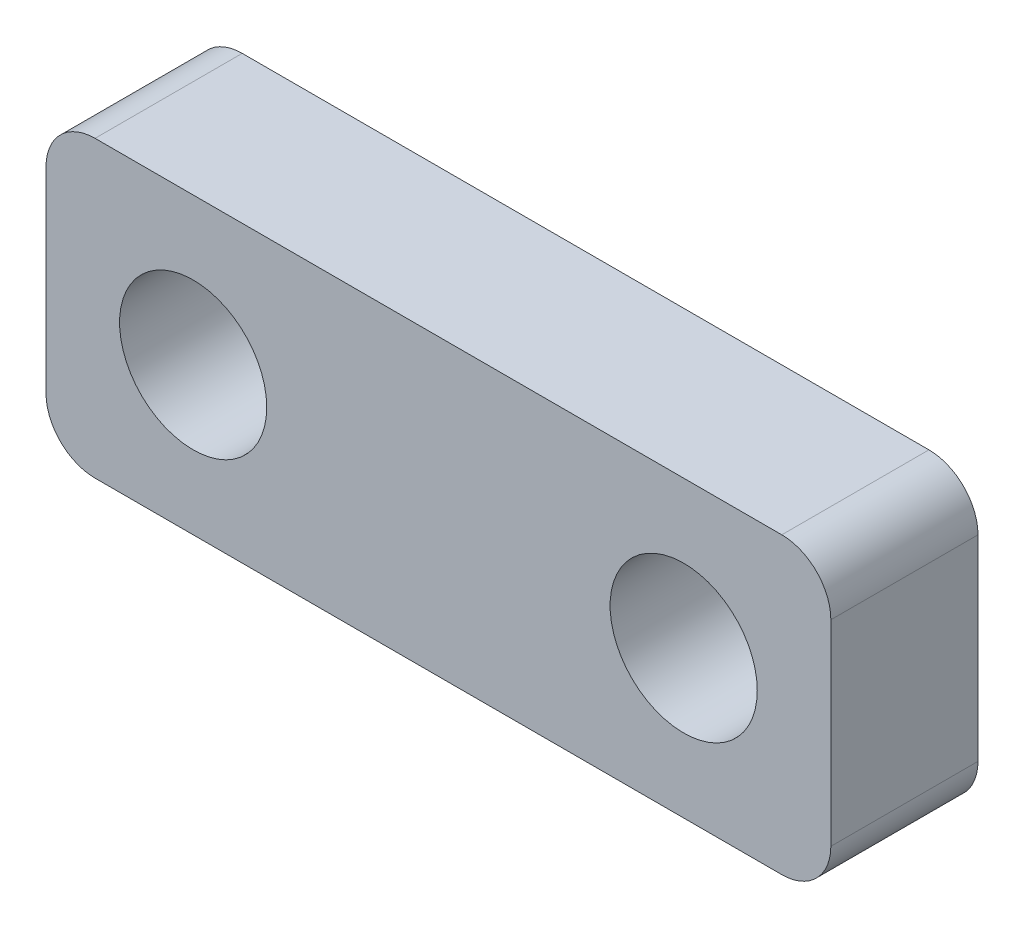
ISO-10303-21;
HEADER;
FILE_DESCRIPTION(('STEP AP214'),'2;1');
FILE_NAME('part.step','',(''),(''),'','','');
FILE_SCHEMA(('AUTOMOTIVE_DESIGN { 1 0 10303 214 1 1 1 1 }'));
ENDSEC;
DATA;
#1=APPLICATION_CONTEXT('core data for automotive mechanical design processes');
#2=APPLICATION_PROTOCOL_DEFINITION('international standard','automotive_design',2000,#1);
#3=PRODUCT_CONTEXT('',#1,'mechanical');
#4=PRODUCT('Part','Part','',(#3));
#5=PRODUCT_RELATED_PRODUCT_CATEGORY('part','',(#4));
#6=PRODUCT_DEFINITION_FORMATION('','',#4);
#7=PRODUCT_DEFINITION_CONTEXT('part definition',#1,'design');
#8=PRODUCT_DEFINITION('design','',#6,#7);
#9=PRODUCT_DEFINITION_SHAPE('','',#8);
#10=(LENGTH_UNIT() NAMED_UNIT(*) SI_UNIT(.MILLI.,.METRE.));
#11=(NAMED_UNIT(*) PLANE_ANGLE_UNIT() SI_UNIT($,.RADIAN.));
#12=(NAMED_UNIT(*) SI_UNIT($,.STERADIAN.) SOLID_ANGLE_UNIT());
#13=UNCERTAINTY_MEASURE_WITH_UNIT(LENGTH_MEASURE(1.E-05),#10,'distance_accuracy_value','');
#14=(GEOMETRIC_REPRESENTATION_CONTEXT(3) GLOBAL_UNCERTAINTY_ASSIGNED_CONTEXT((#13)) GLOBAL_UNIT_ASSIGNED_CONTEXT((#10,
#11,#12)) REPRESENTATION_CONTEXT('',''));
#15=CARTESIAN_POINT('',(0.,0.,0.));
#16=DIRECTION('',(0.,0.,1.));
#17=DIRECTION('',(1.,0.,0.));
#18=AXIS2_PLACEMENT_3D('',#15,#16,#17);
#19=CARTESIAN_POINT('',(8.,3.,3.));
#20=DIRECTION('',(-1.,0.,0.));
#21=DIRECTION('',(0.,0.,1.));
#22=AXIS2_PLACEMENT_3D('',#19,#20,#21);
#23=PLANE('',#22);
#24=DIRECTION('',(0.,1.,0.));
#25=VECTOR('',#24,1.);
#26=CARTESIAN_POINT('',(8.,3.,0.));
#27=LINE('',#26,#25);
#28=CARTESIAN_POINT('',(8.,-2.,0.));
#29=VERTEX_POINT('',#28);
#30=CARTESIAN_POINT('',(8.,2.,0.));
#31=VERTEX_POINT('',#30);
#32=EDGE_CURVE('E146',#29,#31,#27,.T.);
#33=ORIENTED_EDGE('',*,*,#32,.T.);
#34=DIRECTION('',(0.,0.,-1.));
#35=VECTOR('',#34,1.);
#36=CARTESIAN_POINT('',(8.,2.,3.));
#37=LINE('',#36,#35);
#38=CARTESIAN_POINT('',(8.,2.,3.));
#39=VERTEX_POINT('',#38);
#40=EDGE_CURVE('E180',#31,#39,#37,.F.);
#41=ORIENTED_EDGE('',*,*,#40,.T.);
#42=DIRECTION('',(0.,1.,0.));
#43=VECTOR('',#42,1.);
#44=CARTESIAN_POINT('',(8.,3.,3.));
#45=LINE('',#44,#43);
#46=CARTESIAN_POINT('',(8.,-2.,3.));
#47=VERTEX_POINT('',#46);
#48=EDGE_CURVE('E144',#47,#39,#45,.T.);
#49=ORIENTED_EDGE('',*,*,#48,.F.);
#50=DIRECTION('',(0.,0.,-1.));
#51=VECTOR('',#50,1.);
#52=CARTESIAN_POINT('',(8.,-2.,3.));
#53=LINE('',#52,#51);
#54=EDGE_CURVE('E176',#47,#29,#53,.T.);
#55=ORIENTED_EDGE('',*,*,#54,.T.);
#56=EDGE_LOOP('',(#33,#41,#49,#55));
#57=FACE_BOUND('',#56,.T.);
#58=ADVANCED_FACE('F45',(#57),#23,.F.);
#59=CARTESIAN_POINT('',(-8.,3.,3.));
#60=DIRECTION('',(0.,-1.,0.));
#61=DIRECTION('',(0.,0.,-1.));
#62=AXIS2_PLACEMENT_3D('',#59,#60,#61);
#63=PLANE('',#62);
#64=DIRECTION('',(-1.,0.,0.));
#65=VECTOR('',#64,1.);
#66=CARTESIAN_POINT('',(-8.,3.,0.));
#67=LINE('',#66,#65);
#68=CARTESIAN_POINT('',(7.,3.,0.));
#69=VERTEX_POINT('',#68);
#70=CARTESIAN_POINT('',(-7.,3.,0.));
#71=VERTEX_POINT('',#70);
#72=EDGE_CURVE('E140',#69,#71,#67,.T.);
#73=ORIENTED_EDGE('',*,*,#72,.T.);
#74=DIRECTION('',(0.,0.,-1.));
#75=VECTOR('',#74,1.);
#76=CARTESIAN_POINT('',(-7.,3.,3.));
#77=LINE('',#76,#75);
#78=CARTESIAN_POINT('',(-7.,3.,3.));
#79=VERTEX_POINT('',#78);
#80=EDGE_CURVE('E116',#71,#79,#77,.F.);
#81=ORIENTED_EDGE('',*,*,#80,.T.);
#82=DIRECTION('',(-1.,0.,0.));
#83=VECTOR('',#82,1.);
#84=CARTESIAN_POINT('',(-8.,3.,3.));
#85=LINE('',#84,#83);
#86=CARTESIAN_POINT('',(7.,3.,3.));
#87=VERTEX_POINT('',#86);
#88=EDGE_CURVE('E199',#87,#79,#85,.T.);
#89=ORIENTED_EDGE('',*,*,#88,.F.);
#90=DIRECTION('',(0.,0.,-1.));
#91=VECTOR('',#90,1.);
#92=CARTESIAN_POINT('',(7.,3.,3.));
#93=LINE('',#92,#91);
#94=EDGE_CURVE('E122',#87,#69,#93,.T.);
#95=ORIENTED_EDGE('',*,*,#94,.T.);
#96=EDGE_LOOP('',(#73,#81,#89,#95));
#97=FACE_BOUND('',#96,.T.);
#98=ADVANCED_FACE('F246',(#97),#63,.F.);
#99=CARTESIAN_POINT('',(-8.,3.,3.));
#100=DIRECTION('',(1.,0.,0.));
#101=DIRECTION('',(0.,0.,-1.));
#102=AXIS2_PLACEMENT_3D('',#99,#100,#101);
#103=PLANE('',#102);
#104=DIRECTION('',(0.,-1.,0.));
#105=VECTOR('',#104,1.);
#106=CARTESIAN_POINT('',(-8.,3.,3.));
#107=LINE('',#106,#105);
#108=CARTESIAN_POINT('',(-8.,2.,3.));
#109=VERTEX_POINT('',#108);
#110=CARTESIAN_POINT('',(-8.,-2.,3.));
#111=VERTEX_POINT('',#110);
#112=EDGE_CURVE('E131',#109,#111,#107,.T.);
#113=ORIENTED_EDGE('',*,*,#112,.F.);
#114=DIRECTION('',(0.,0.,-1.));
#115=VECTOR('',#114,1.);
#116=CARTESIAN_POINT('',(-8.,2.,3.));
#117=LINE('',#116,#115);
#118=CARTESIAN_POINT('',(-8.,2.,0.));
#119=VERTEX_POINT('',#118);
#120=EDGE_CURVE('E115',#109,#119,#117,.T.);
#121=ORIENTED_EDGE('',*,*,#120,.T.);
#122=DIRECTION('',(0.,-1.,0.));
#123=VECTOR('',#122,1.);
#124=CARTESIAN_POINT('',(-8.,3.,0.));
#125=LINE('',#124,#123);
#126=CARTESIAN_POINT('',(-8.,-2.,0.));
#127=VERTEX_POINT('',#126);
#128=EDGE_CURVE('E129',#119,#127,#125,.T.);
#129=ORIENTED_EDGE('',*,*,#128,.T.);
#130=DIRECTION('',(0.,0.,-1.));
#131=VECTOR('',#130,1.);
#132=CARTESIAN_POINT('',(-8.,-2.,3.));
#133=LINE('',#132,#131);
#134=EDGE_CURVE('E134',#127,#111,#133,.F.);
#135=ORIENTED_EDGE('',*,*,#134,.T.);
#136=EDGE_LOOP('',(#113,#121,#129,#135));
#137=FACE_BOUND('',#136,.T.);
#138=ADVANCED_FACE('F128',(#137),#103,.F.);
#139=CARTESIAN_POINT('',(-8.,-3.,3.));
#140=DIRECTION('',(0.,1.,0.));
#141=DIRECTION('',(0.,0.,1.));
#142=AXIS2_PLACEMENT_3D('',#139,#140,#141);
#143=PLANE('',#142);
#144=DIRECTION('',(1.,0.,0.));
#145=VECTOR('',#144,1.);
#146=CARTESIAN_POINT('',(-8.,-3.,0.));
#147=LINE('',#146,#145);
#148=CARTESIAN_POINT('',(-7.,-3.,0.));
#149=VERTEX_POINT('',#148);
#150=CARTESIAN_POINT('',(7.,-3.,0.));
#151=VERTEX_POINT('',#150);
#152=EDGE_CURVE('E139',#149,#151,#147,.T.);
#153=ORIENTED_EDGE('',*,*,#152,.T.);
#154=DIRECTION('',(0.,0.,-1.));
#155=VECTOR('',#154,1.);
#156=CARTESIAN_POINT('',(7.,-3.,3.));
#157=LINE('',#156,#155);
#158=CARTESIAN_POINT('',(7.,-3.,3.));
#159=VERTEX_POINT('',#158);
#160=EDGE_CURVE('E11',#151,#159,#157,.F.);
#161=ORIENTED_EDGE('',*,*,#160,.T.);
#162=DIRECTION('',(1.,0.,0.));
#163=VECTOR('',#162,1.);
#164=CARTESIAN_POINT('',(-8.,-3.,3.));
#165=LINE('',#164,#163);
#166=CARTESIAN_POINT('',(-7.,-3.,3.));
#167=VERTEX_POINT('',#166);
#168=EDGE_CURVE('E151',#167,#159,#165,.T.);
#169=ORIENTED_EDGE('',*,*,#168,.F.);
#170=DIRECTION('',(0.,0.,-1.));
#171=VECTOR('',#170,1.);
#172=CARTESIAN_POINT('',(-7.,-3.,3.));
#173=LINE('',#172,#171);
#174=EDGE_CURVE('E54',#167,#149,#173,.T.);
#175=ORIENTED_EDGE('',*,*,#174,.T.);
#176=EDGE_LOOP('',(#153,#161,#169,#175));
#177=FACE_BOUND('',#176,.T.);
#178=ADVANCED_FACE('F185',(#177),#143,.F.);
#179=CARTESIAN_POINT('',(0.,0.,3.));
#180=DIRECTION('',(0.,0.,1.));
#181=DIRECTION('',(1.,0.,0.));
#182=AXIS2_PLACEMENT_3D('',#179,#180,#181);
#183=PLANE('',#182);
#184=CARTESIAN_POINT('',(-5.,0.,3.));
#185=DIRECTION('',(0.,0.,1.));
#186=DIRECTION('',(1.,0.,0.));
#187=AXIS2_PLACEMENT_3D('',#184,#185,#186);
#188=CIRCLE('',#187,1.5);
#189=CARTESIAN_POINT('',(-3.5,0.,3.));
#190=VERTEX_POINT('',#189);
#191=EDGE_CURVE('E215',#190,#190,#188,.T.);
#192=ORIENTED_EDGE('',*,*,#191,.F.);
#193=EDGE_LOOP('',(#192));
#194=FACE_BOUND('',#193,.T.);
#195=CARTESIAN_POINT('',(5.,0.,3.));
#196=DIRECTION('',(0.,0.,1.));
#197=DIRECTION('',(1.,0.,0.));
#198=AXIS2_PLACEMENT_3D('',#195,#196,#197);
#199=CIRCLE('',#198,1.5);
#200=CARTESIAN_POINT('',(6.5,0.,3.));
#201=VERTEX_POINT('',#200);
#202=EDGE_CURVE('E221',#201,#201,#199,.T.);
#203=ORIENTED_EDGE('',*,*,#202,.F.);
#204=EDGE_LOOP('',(#203));
#205=FACE_BOUND('',#204,.T.);
#206=ORIENTED_EDGE('',*,*,#88,.T.);
#207=CARTESIAN_POINT('',(-7.,2.,3.));
#208=DIRECTION('',(0.,0.,1.));
#209=DIRECTION('',(1.,0.,0.));
#210=AXIS2_PLACEMENT_3D('',#207,#208,#209);
#211=CIRCLE('',#210,1.);
#212=EDGE_CURVE('E173',#79,#109,#211,.T.);
#213=ORIENTED_EDGE('',*,*,#212,.T.);
#214=ORIENTED_EDGE('',*,*,#112,.T.);
#215=CARTESIAN_POINT('',(-7.,-2.,3.));
#216=DIRECTION('',(0.,0.,1.));
#217=DIRECTION('',(1.,0.,0.));
#218=AXIS2_PLACEMENT_3D('',#215,#216,#217);
#219=CIRCLE('',#218,1.);
#220=EDGE_CURVE('E66',#111,#167,#219,.T.);
#221=ORIENTED_EDGE('',*,*,#220,.T.);
#222=ORIENTED_EDGE('',*,*,#168,.T.);
#223=CARTESIAN_POINT('',(7.,-2.,3.));
#224=DIRECTION('',(0.,0.,1.));
#225=DIRECTION('',(1.,0.,0.));
#226=AXIS2_PLACEMENT_3D('',#223,#224,#225);
#227=CIRCLE('',#226,1.);
#228=EDGE_CURVE('E167',#159,#47,#227,.T.);
#229=ORIENTED_EDGE('',*,*,#228,.T.);
#230=ORIENTED_EDGE('',*,*,#48,.T.);
#231=CARTESIAN_POINT('',(7.,2.,3.));
#232=DIRECTION('',(0.,0.,1.));
#233=DIRECTION('',(1.,0.,0.));
#234=AXIS2_PLACEMENT_3D('',#231,#232,#233);
#235=CIRCLE('',#234,1.);
#236=EDGE_CURVE('E170',#39,#87,#235,.T.);
#237=ORIENTED_EDGE('',*,*,#236,.T.);
#238=EDGE_LOOP('',(#206,#213,#214,#221,#222,#229,#230,#237));
#239=FACE_BOUND('',#238,.T.);
#240=ADVANCED_FACE('F242',(#194,#205,#239),#183,.T.);
#241=CARTESIAN_POINT('',(0.,0.,0.));
#242=DIRECTION('',(0.,0.,1.));
#243=DIRECTION('',(1.,0.,0.));
#244=AXIS2_PLACEMENT_3D('',#241,#242,#243);
#245=PLANE('',#244);
#246=CARTESIAN_POINT('',(-5.,0.,0.));
#247=DIRECTION('',(0.,0.,1.));
#248=DIRECTION('',(1.,0.,0.));
#249=AXIS2_PLACEMENT_3D('',#246,#247,#248);
#250=CIRCLE('',#249,1.5);
#251=CARTESIAN_POINT('',(-3.5,0.,0.));
#252=VERTEX_POINT('',#251);
#253=EDGE_CURVE('E212',#252,#252,#250,.T.);
#254=ORIENTED_EDGE('',*,*,#253,.T.);
#255=EDGE_LOOP('',(#254));
#256=FACE_BOUND('',#255,.T.);
#257=CARTESIAN_POINT('',(5.,0.,0.));
#258=DIRECTION('',(0.,0.,1.));
#259=DIRECTION('',(1.,0.,0.));
#260=AXIS2_PLACEMENT_3D('',#257,#258,#259);
#261=CIRCLE('',#260,1.5);
#262=CARTESIAN_POINT('',(6.5,0.,0.));
#263=VERTEX_POINT('',#262);
#264=EDGE_CURVE('E205',#263,#263,#261,.T.);
#265=ORIENTED_EDGE('',*,*,#264,.T.);
#266=EDGE_LOOP('',(#265));
#267=FACE_BOUND('',#266,.T.);
#268=ORIENTED_EDGE('',*,*,#128,.F.);
#269=CARTESIAN_POINT('',(-7.,2.,0.));
#270=DIRECTION('',(0.,0.,1.));
#271=DIRECTION('',(1.,0.,0.));
#272=AXIS2_PLACEMENT_3D('',#269,#270,#271);
#273=CIRCLE('',#272,1.);
#274=EDGE_CURVE('E111',#119,#71,#273,.F.);
#275=ORIENTED_EDGE('',*,*,#274,.T.);
#276=ORIENTED_EDGE('',*,*,#72,.F.);
#277=CARTESIAN_POINT('',(7.,2.,0.));
#278=DIRECTION('',(0.,0.,1.));
#279=DIRECTION('',(1.,0.,0.));
#280=AXIS2_PLACEMENT_3D('',#277,#278,#279);
#281=CIRCLE('',#280,1.);
#282=EDGE_CURVE('E123',#69,#31,#281,.F.);
#283=ORIENTED_EDGE('',*,*,#282,.T.);
#284=ORIENTED_EDGE('',*,*,#32,.F.);
#285=CARTESIAN_POINT('',(7.,-2.,0.));
#286=DIRECTION('',(0.,0.,1.));
#287=DIRECTION('',(1.,0.,0.));
#288=AXIS2_PLACEMENT_3D('',#285,#286,#287);
#289=CIRCLE('',#288,1.);
#290=EDGE_CURVE('E155',#29,#151,#289,.F.);
#291=ORIENTED_EDGE('',*,*,#290,.T.);
#292=ORIENTED_EDGE('',*,*,#152,.F.);
#293=CARTESIAN_POINT('',(-7.,-2.,0.));
#294=DIRECTION('',(0.,0.,1.));
#295=DIRECTION('',(1.,0.,0.));
#296=AXIS2_PLACEMENT_3D('',#293,#294,#295);
#297=CIRCLE('',#296,1.);
#298=EDGE_CURVE('E133',#149,#127,#297,.F.);
#299=ORIENTED_EDGE('',*,*,#298,.T.);
#300=EDGE_LOOP('',(#268,#275,#276,#283,#284,#291,#292,#299));
#301=FACE_BOUND('',#300,.T.);
#302=ADVANCED_FACE('F136',(#256,#267,#301),#245,.F.);
#303=CARTESIAN_POINT('',(5.,0.,0.));
#304=DIRECTION('',(0.,0.,1.));
#305=DIRECTION('',(1.,0.,0.));
#306=AXIS2_PLACEMENT_3D('',#303,#304,#305);
#307=CYLINDRICAL_SURFACE('',#306,1.5);
#308=ORIENTED_EDGE('',*,*,#264,.F.);
#309=EDGE_LOOP('',(#308));
#310=FACE_BOUND('',#309,.T.);
#311=ORIENTED_EDGE('',*,*,#202,.T.);
#312=EDGE_LOOP('',(#311));
#313=FACE_BOUND('',#312,.T.);
#314=ADVANCED_FACE('F232',(#310,#313),#307,.F.);
#315=CARTESIAN_POINT('',(-5.,0.,0.));
#316=DIRECTION('',(0.,0.,1.));
#317=DIRECTION('',(1.,0.,0.));
#318=AXIS2_PLACEMENT_3D('',#315,#316,#317);
#319=CYLINDRICAL_SURFACE('',#318,1.5);
#320=ORIENTED_EDGE('',*,*,#253,.F.);
#321=EDGE_LOOP('',(#320));
#322=FACE_BOUND('',#321,.T.);
#323=ORIENTED_EDGE('',*,*,#191,.T.);
#324=EDGE_LOOP('',(#323));
#325=FACE_BOUND('',#324,.T.);
#326=ADVANCED_FACE('F234',(#322,#325),#319,.F.);
#327=CARTESIAN_POINT('',(-7.,2.,3.));
#328=DIRECTION('',(0.,0.,-1.));
#329=DIRECTION('',(-1.,0.,0.));
#330=AXIS2_PLACEMENT_3D('',#327,#328,#329);
#331=CYLINDRICAL_SURFACE('',#330,1.);
#332=ORIENTED_EDGE('',*,*,#212,.F.);
#333=ORIENTED_EDGE('',*,*,#80,.F.);
#334=ORIENTED_EDGE('',*,*,#274,.F.);
#335=ORIENTED_EDGE('',*,*,#120,.F.);
#336=EDGE_LOOP('',(#332,#333,#334,#335));
#337=FACE_BOUND('',#336,.T.);
#338=ADVANCED_FACE('F114',(#337),#331,.T.);
#339=CARTESIAN_POINT('',(7.,2.,3.));
#340=DIRECTION('',(0.,0.,-1.));
#341=DIRECTION('',(-1.,0.,0.));
#342=AXIS2_PLACEMENT_3D('',#339,#340,#341);
#343=CYLINDRICAL_SURFACE('',#342,1.);
#344=ORIENTED_EDGE('',*,*,#236,.F.);
#345=ORIENTED_EDGE('',*,*,#40,.F.);
#346=ORIENTED_EDGE('',*,*,#282,.F.);
#347=ORIENTED_EDGE('',*,*,#94,.F.);
#348=EDGE_LOOP('',(#344,#345,#346,#347));
#349=FACE_BOUND('',#348,.T.);
#350=ADVANCED_FACE('F257',(#349),#343,.T.);
#351=CARTESIAN_POINT('',(7.,-2.,3.));
#352=DIRECTION('',(0.,0.,-1.));
#353=DIRECTION('',(-1.,0.,0.));
#354=AXIS2_PLACEMENT_3D('',#351,#352,#353);
#355=CYLINDRICAL_SURFACE('',#354,1.);
#356=ORIENTED_EDGE('',*,*,#228,.F.);
#357=ORIENTED_EDGE('',*,*,#160,.F.);
#358=ORIENTED_EDGE('',*,*,#290,.F.);
#359=ORIENTED_EDGE('',*,*,#54,.F.);
#360=EDGE_LOOP('',(#356,#357,#358,#359));
#361=FACE_BOUND('',#360,.T.);
#362=ADVANCED_FACE('F192',(#361),#355,.T.);
#363=CARTESIAN_POINT('',(-7.,-2.,3.));
#364=DIRECTION('',(0.,0.,-1.));
#365=DIRECTION('',(-1.,0.,0.));
#366=AXIS2_PLACEMENT_3D('',#363,#364,#365);
#367=CYLINDRICAL_SURFACE('',#366,1.);
#368=ORIENTED_EDGE('',*,*,#220,.F.);
#369=ORIENTED_EDGE('',*,*,#134,.F.);
#370=ORIENTED_EDGE('',*,*,#298,.F.);
#371=ORIENTED_EDGE('',*,*,#174,.F.);
#372=EDGE_LOOP('',(#368,#369,#370,#371));
#373=FACE_BOUND('',#372,.T.);
#374=ADVANCED_FACE('F47',(#373),#367,.T.);
#375=CLOSED_SHELL('',(#58,#98,#138,#178,#240,#302,#314,#326,#338,#350,#362,#374));
#376=MANIFOLD_SOLID_BREP('B2',#375);
#377=ADVANCED_BREP_SHAPE_REPRESENTATION('',(#18,#376),#14);
#378=SHAPE_DEFINITION_REPRESENTATION(#9,#377);
ENDSEC;
END-ISO-10303-21;
